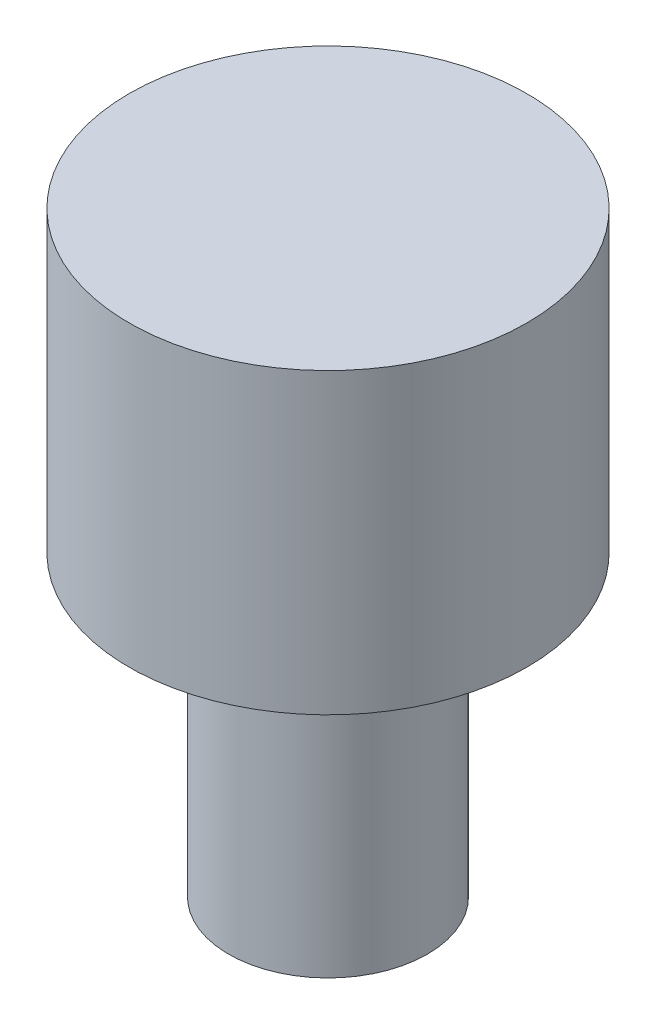
ISO-10303-21;
HEADER;
FILE_DESCRIPTION(('STEP AP214'),'2;1');
FILE_NAME('part.step','',(''),(''),'','','');
FILE_SCHEMA(('AUTOMOTIVE_DESIGN { 1 0 10303 214 1 1 1 1 }'));
ENDSEC;
DATA;
#1=APPLICATION_CONTEXT('core data for automotive mechanical design processes');
#2=APPLICATION_PROTOCOL_DEFINITION('international standard','automotive_design',2000,#1);
#3=PRODUCT_CONTEXT('',#1,'mechanical');
#4=PRODUCT('Part','Part','',(#3));
#5=PRODUCT_RELATED_PRODUCT_CATEGORY('part','',(#4));
#6=PRODUCT_DEFINITION_FORMATION('','',#4);
#7=PRODUCT_DEFINITION_CONTEXT('part definition',#1,'design');
#8=PRODUCT_DEFINITION('design','',#6,#7);
#9=PRODUCT_DEFINITION_SHAPE('','',#8);
#10=(LENGTH_UNIT() NAMED_UNIT(*) SI_UNIT(.MILLI.,.METRE.));
#11=(NAMED_UNIT(*) PLANE_ANGLE_UNIT() SI_UNIT($,.RADIAN.));
#12=(NAMED_UNIT(*) SI_UNIT($,.STERADIAN.) SOLID_ANGLE_UNIT());
#13=UNCERTAINTY_MEASURE_WITH_UNIT(LENGTH_MEASURE(1.E-05),#10,'distance_accuracy_value','');
#14=(GEOMETRIC_REPRESENTATION_CONTEXT(3) GLOBAL_UNCERTAINTY_ASSIGNED_CONTEXT((#13)) GLOBAL_UNIT_ASSIGNED_CONTEXT((#10,
#11,#12)) REPRESENTATION_CONTEXT('',''));
#15=CARTESIAN_POINT('',(0.,0.,0.));
#16=DIRECTION('',(0.,0.,1.));
#17=DIRECTION('',(1.,0.,0.));
#18=AXIS2_PLACEMENT_3D('',#15,#16,#17);
#19=CARTESIAN_POINT('',(0.,30.,0.));
#20=DIRECTION('',(0.,-1.,0.));
#21=DIRECTION('',(1.,0.,0.));
#22=AXIS2_PLACEMENT_3D('',#19,#20,#21);
#23=PLANE('',#22);
#24=CARTESIAN_POINT('',(0.,30.,0.));
#25=DIRECTION('',(0.,-1.,0.));
#26=DIRECTION('',(1.,0.,0.));
#27=AXIS2_PLACEMENT_3D('',#24,#25,#26);
#28=CIRCLE('',#27,20.);
#29=CARTESIAN_POINT('',(20.,30.,0.));
#30=VERTEX_POINT('',#29);
#31=EDGE_CURVE('E10',#30,#30,#28,.T.);
#32=ORIENTED_EDGE('',*,*,#31,.F.);
#33=EDGE_LOOP('',(#32));
#34=FACE_BOUND('',#33,.T.);
#35=ADVANCED_FACE('F35',(#34),#23,.F.);
#36=CARTESIAN_POINT('',(0.,-30.,0.));
#37=DIRECTION('',(0.,-1.,0.));
#38=DIRECTION('',(1.,0.,0.));
#39=AXIS2_PLACEMENT_3D('',#36,#37,#38);
#40=CYLINDRICAL_SURFACE('',#39,20.);
#41=CARTESIAN_POINT('',(0.,0.,0.));
#42=DIRECTION('',(0.,-1.,0.));
#43=DIRECTION('',(1.,0.,0.));
#44=AXIS2_PLACEMENT_3D('',#41,#42,#43);
#45=CIRCLE('',#44,20.);
#46=CARTESIAN_POINT('',(20.,0.,0.));
#47=VERTEX_POINT('',#46);
#48=EDGE_CURVE('E41',#47,#47,#45,.T.);
#49=ORIENTED_EDGE('',*,*,#48,.F.);
#50=EDGE_LOOP('',(#49));
#51=FACE_BOUND('',#50,.T.);
#52=ORIENTED_EDGE('',*,*,#31,.T.);
#53=EDGE_LOOP('',(#52));
#54=FACE_BOUND('',#53,.T.);
#55=ADVANCED_FACE('F65',(#51,#54),#40,.T.);
#56=CARTESIAN_POINT('',(-20.,0.,0.));
#57=DIRECTION('',(0.,1.,0.));
#58=DIRECTION('',(-1.,0.,0.));
#59=AXIS2_PLACEMENT_3D('',#56,#57,#58);
#60=PLANE('',#59);
#61=CARTESIAN_POINT('',(0.,0.,0.));
#62=DIRECTION('',(0.,-1.,0.));
#63=DIRECTION('',(1.,0.,0.));
#64=AXIS2_PLACEMENT_3D('',#61,#62,#63);
#65=CIRCLE('',#64,10.);
#66=CARTESIAN_POINT('',(10.,0.,0.));
#67=VERTEX_POINT('',#66);
#68=EDGE_CURVE('E45',#67,#67,#65,.T.);
#69=ORIENTED_EDGE('',*,*,#68,.F.);
#70=EDGE_LOOP('',(#69));
#71=FACE_BOUND('',#70,.T.);
#72=ORIENTED_EDGE('',*,*,#48,.T.);
#73=EDGE_LOOP('',(#72));
#74=FACE_BOUND('',#73,.T.);
#75=ADVANCED_FACE('F60',(#71,#74),#60,.F.);
#76=CARTESIAN_POINT('',(0.,-30.,0.));
#77=DIRECTION('',(0.,-1.,0.));
#78=DIRECTION('',(1.,0.,0.));
#79=AXIS2_PLACEMENT_3D('',#76,#77,#78);
#80=CYLINDRICAL_SURFACE('',#79,10.);
#81=CARTESIAN_POINT('',(0.,-30.,0.));
#82=DIRECTION('',(0.,-1.,0.));
#83=DIRECTION('',(1.,0.,0.));
#84=AXIS2_PLACEMENT_3D('',#81,#82,#83);
#85=CIRCLE('',#84,10.);
#86=CARTESIAN_POINT('',(10.,-30.,0.));
#87=VERTEX_POINT('',#86);
#88=EDGE_CURVE('E49',#87,#87,#85,.T.);
#89=ORIENTED_EDGE('',*,*,#88,.F.);
#90=EDGE_LOOP('',(#89));
#91=FACE_BOUND('',#90,.T.);
#92=ORIENTED_EDGE('',*,*,#68,.T.);
#93=EDGE_LOOP('',(#92));
#94=FACE_BOUND('',#93,.T.);
#95=ADVANCED_FACE('F57',(#91,#94),#80,.T.);
#96=CARTESIAN_POINT('',(-9.99999999999999,-30.,0.));
#97=DIRECTION('',(0.,1.,0.));
#98=DIRECTION('',(-1.,0.,0.));
#99=AXIS2_PLACEMENT_3D('',#96,#97,#98);
#100=PLANE('',#99);
#101=ORIENTED_EDGE('',*,*,#88,.T.);
#102=EDGE_LOOP('',(#101));
#103=FACE_BOUND('',#102,.T.);
#104=ADVANCED_FACE('F55',(#103),#100,.F.);
#105=CLOSED_SHELL('',(#35,#55,#75,#95,#104));
#106=MANIFOLD_SOLID_BREP('B2',#105);
#107=ADVANCED_BREP_SHAPE_REPRESENTATION('',(#18,#106),#14);
#108=SHAPE_DEFINITION_REPRESENTATION(#9,#107);
ENDSEC;
END-ISO-10303-21;
